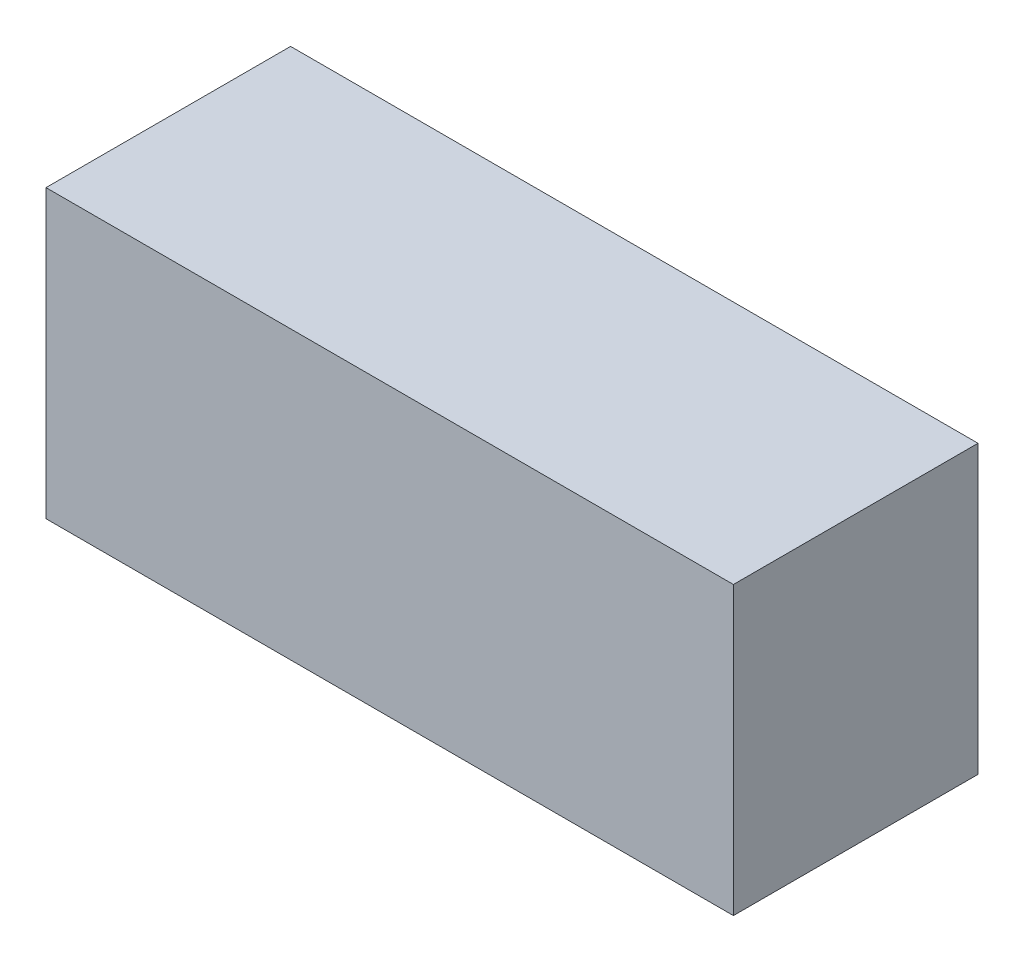
ISO-10303-21;
HEADER;
FILE_DESCRIPTION(('STEP AP214'),'2;1');
FILE_NAME('part.step','',(''),(''),'','','');
FILE_SCHEMA(('AUTOMOTIVE_DESIGN { 1 0 10303 214 1 1 1 1 }'));
ENDSEC;
DATA;
#1=APPLICATION_CONTEXT('core data for automotive mechanical design processes');
#2=APPLICATION_PROTOCOL_DEFINITION('international standard','automotive_design',2000,#1);
#3=PRODUCT_CONTEXT('',#1,'mechanical');
#4=PRODUCT('Part','Part','',(#3));
#5=PRODUCT_RELATED_PRODUCT_CATEGORY('part','',(#4));
#6=PRODUCT_DEFINITION_FORMATION('','',#4);
#7=PRODUCT_DEFINITION_CONTEXT('part definition',#1,'design');
#8=PRODUCT_DEFINITION('design','',#6,#7);
#9=PRODUCT_DEFINITION_SHAPE('','',#8);
#10=(LENGTH_UNIT() NAMED_UNIT(*) SI_UNIT(.MILLI.,.METRE.));
#11=(NAMED_UNIT(*) PLANE_ANGLE_UNIT() SI_UNIT($,.RADIAN.));
#12=(NAMED_UNIT(*) SI_UNIT($,.STERADIAN.) SOLID_ANGLE_UNIT());
#13=UNCERTAINTY_MEASURE_WITH_UNIT(LENGTH_MEASURE(1.E-05),#10,'distance_accuracy_value','');
#14=(GEOMETRIC_REPRESENTATION_CONTEXT(3) GLOBAL_UNCERTAINTY_ASSIGNED_CONTEXT((#13)) GLOBAL_UNIT_ASSIGNED_CONTEXT((#10,
#11,#12)) REPRESENTATION_CONTEXT('',''));
#15=CARTESIAN_POINT('',(0.,0.,0.));
#16=DIRECTION('',(0.,0.,1.));
#17=DIRECTION('',(1.,0.,0.));
#18=AXIS2_PLACEMENT_3D('',#15,#16,#17);
#19=CARTESIAN_POINT('',(32.6228000000035,-43.7918200006,1.19916001190173));
#20=DIRECTION('',(1.02069463991939E-11,1.,5.10341196927923E-12));
#21=DIRECTION('',(0.,5.10341196927923E-12,-1.));
#22=AXIS2_PLACEMENT_3D('',#19,#20,#21);
#23=PLANE('',#22);
#24=DIRECTION('',(0.,-5.10341196927923E-12,1.));
#25=VECTOR('',#24,1.);
#26=CARTESIAN_POINT('',(33.4378000000035,-43.7918200006068,0.909160011901735));
#27=LINE('',#26,#25);
#28=CARTESIAN_POINT('',(33.4378000000035,-43.7918200006068,0.909160011901735));
#29=VERTEX_POINT('',#28);
#30=CARTESIAN_POINT('',(33.4378000000035,-43.7918200006098,1.48916001190173));
#31=VERTEX_POINT('',#30);
#32=EDGE_CURVE('E97',#29,#31,#27,.T.);
#33=ORIENTED_EDGE('',*,*,#32,.F.);
#34=DIRECTION('',(1.,-1.02069463991939E-11,0.));
#35=VECTOR('',#34,1.);
#36=CARTESIAN_POINT('',(31.8078000000034,-43.7918200005902,0.909160011901735));
#37=LINE('',#36,#35);
#38=CARTESIAN_POINT('',(31.8078000000034,-43.7918200005902,0.909160011901735));
#39=VERTEX_POINT('',#38);
#40=EDGE_CURVE('E27',#39,#29,#37,.T.);
#41=ORIENTED_EDGE('',*,*,#40,.F.);
#42=DIRECTION('',(0.,5.10341196927923E-12,-1.));
#43=VECTOR('',#42,1.);
#44=CARTESIAN_POINT('',(31.8078000000034,-43.7918200005902,0.909160011901735));
#45=LINE('',#44,#43);
#46=CARTESIAN_POINT('',(31.8078000000034,-43.7918200005932,1.48916001190173));
#47=VERTEX_POINT('',#46);
#48=EDGE_CURVE('E64',#47,#39,#45,.T.);
#49=ORIENTED_EDGE('',*,*,#48,.F.);
#50=DIRECTION('',(-1.,1.02069463991939E-11,0.));
#51=VECTOR('',#50,1.);
#52=CARTESIAN_POINT('',(31.8078000000034,-43.7918200005932,1.48916001190173));
#53=LINE('',#52,#51);
#54=EDGE_CURVE('E86',#31,#47,#53,.T.);
#55=ORIENTED_EDGE('',*,*,#54,.F.);
#56=EDGE_LOOP('',(#33,#41,#49,#55));
#57=FACE_BOUND('',#56,.T.);
#58=ADVANCED_FACE('F16',(#57),#23,.T.);
#59=CARTESIAN_POINT('',(32.6227999999966,-44.4718200006,1.19916001189826));
#60=DIRECTION('',(1.02069463991939E-11,1.,5.10341196927923E-12));
#61=DIRECTION('',(0.,5.10341196927923E-12,-1.));
#62=AXIS2_PLACEMENT_3D('',#59,#60,#61);
#63=PLANE('',#62);
#64=DIRECTION('',(0.,-5.10341196927923E-12,1.));
#65=VECTOR('',#64,1.);
#66=CARTESIAN_POINT('',(33.4377999999966,-44.4718200006068,0.909160011898265));
#67=LINE('',#66,#65);
#68=CARTESIAN_POINT('',(33.4377999999966,-44.4718200006068,0.909160011898265));
#69=VERTEX_POINT('',#68);
#70=CARTESIAN_POINT('',(33.4377999999966,-44.4718200006098,1.48916001189826));
#71=VERTEX_POINT('',#70);
#72=EDGE_CURVE('E76',#69,#71,#67,.T.);
#73=ORIENTED_EDGE('',*,*,#72,.T.);
#74=DIRECTION('',(-1.,1.02069463991939E-11,0.));
#75=VECTOR('',#74,1.);
#76=CARTESIAN_POINT('',(31.8077999999966,-44.4718200005932,1.48916001189826));
#77=LINE('',#76,#75);
#78=CARTESIAN_POINT('',(31.8077999999966,-44.4718200005932,1.48916001189826));
#79=VERTEX_POINT('',#78);
#80=EDGE_CURVE('E110',#71,#79,#77,.T.);
#81=ORIENTED_EDGE('',*,*,#80,.T.);
#82=DIRECTION('',(0.,5.10341196927923E-12,-1.));
#83=VECTOR('',#82,1.);
#84=CARTESIAN_POINT('',(31.8077999999966,-44.4718200005902,0.909160011898265));
#85=LINE('',#84,#83);
#86=CARTESIAN_POINT('',(31.8077999999966,-44.4718200005902,0.909160011898265));
#87=VERTEX_POINT('',#86);
#88=EDGE_CURVE('E78',#79,#87,#85,.T.);
#89=ORIENTED_EDGE('',*,*,#88,.T.);
#90=DIRECTION('',(1.,-1.02069463991939E-11,0.));
#91=VECTOR('',#90,1.);
#92=CARTESIAN_POINT('',(31.8077999999966,-44.4718200005902,0.909160011898265));
#93=LINE('',#92,#91);
#94=EDGE_CURVE('E11',#87,#69,#93,.T.);
#95=ORIENTED_EDGE('',*,*,#94,.T.);
#96=EDGE_LOOP('',(#73,#81,#89,#95));
#97=FACE_BOUND('',#96,.T.);
#98=ADVANCED_FACE('F73',(#97),#63,.F.);
#99=CARTESIAN_POINT('',(31.8077999999966,-44.4718200005902,0.909160011898265));
#100=DIRECTION('',(0.,-5.10341196927923E-12,1.));
#101=DIRECTION('',(1.,-1.02069463991939E-11,0.));
#102=AXIS2_PLACEMENT_3D('',#99,#100,#101);
#103=PLANE('',#102);
#104=ORIENTED_EDGE('',*,*,#40,.T.);
#105=DIRECTION('',(1.02069463991939E-11,1.,5.10341196927923E-12));
#106=VECTOR('',#105,1.);
#107=CARTESIAN_POINT('',(33.4377999999966,-44.4718200006068,0.909160011898265));
#108=LINE('',#107,#106);
#109=EDGE_CURVE('E81',#69,#29,#108,.T.);
#110=ORIENTED_EDGE('',*,*,#109,.F.);
#111=ORIENTED_EDGE('',*,*,#94,.F.);
#112=DIRECTION('',(1.02069463991939E-11,1.,5.10341196927923E-12));
#113=VECTOR('',#112,1.);
#114=CARTESIAN_POINT('',(31.8077999999966,-44.4718200005902,0.909160011898265));
#115=LINE('',#114,#113);
#116=EDGE_CURVE('E20',#87,#39,#115,.T.);
#117=ORIENTED_EDGE('',*,*,#116,.T.);
#118=EDGE_LOOP('',(#104,#110,#111,#117));
#119=FACE_BOUND('',#118,.T.);
#120=ADVANCED_FACE('F18',(#119),#103,.F.);
#121=CARTESIAN_POINT('',(31.8077999999966,-44.4718200005902,0.909160011898265));
#122=DIRECTION('',(1.,-1.02069463991939E-11,0.));
#123=DIRECTION('',(0.,-5.10341196927923E-12,1.));
#124=AXIS2_PLACEMENT_3D('',#121,#122,#123);
#125=PLANE('',#124);
#126=ORIENTED_EDGE('',*,*,#48,.T.);
#127=ORIENTED_EDGE('',*,*,#116,.F.);
#128=ORIENTED_EDGE('',*,*,#88,.F.);
#129=DIRECTION('',(1.02069463991939E-11,1.,5.10341196927923E-12));
#130=VECTOR('',#129,1.);
#131=CARTESIAN_POINT('',(31.8077999999966,-44.4718200005932,1.48916001189826));
#132=LINE('',#131,#130);
#133=EDGE_CURVE('E104',#79,#47,#132,.T.);
#134=ORIENTED_EDGE('',*,*,#133,.T.);
#135=EDGE_LOOP('',(#126,#127,#128,#134));
#136=FACE_BOUND('',#135,.T.);
#137=ADVANCED_FACE('F125',(#136),#125,.F.);
#138=CARTESIAN_POINT('',(31.8077999999966,-44.4718200005932,1.48916001189826));
#139=DIRECTION('',(0.,5.10341196927923E-12,-1.));
#140=DIRECTION('',(1.02069463991939E-11,1.,5.10341196927923E-12));
#141=AXIS2_PLACEMENT_3D('',#138,#139,#140);
#142=PLANE('',#141);
#143=ORIENTED_EDGE('',*,*,#54,.T.);
#144=ORIENTED_EDGE('',*,*,#133,.F.);
#145=ORIENTED_EDGE('',*,*,#80,.F.);
#146=DIRECTION('',(1.02069463991939E-11,1.,5.10341196927923E-12));
#147=VECTOR('',#146,1.);
#148=CARTESIAN_POINT('',(33.4377999999966,-44.4718200006098,1.48916001189826));
#149=LINE('',#148,#147);
#150=EDGE_CURVE('E90',#71,#31,#149,.T.);
#151=ORIENTED_EDGE('',*,*,#150,.T.);
#152=EDGE_LOOP('',(#143,#144,#145,#151));
#153=FACE_BOUND('',#152,.T.);
#154=ADVANCED_FACE('F123',(#153),#142,.F.);
#155=CARTESIAN_POINT('',(33.4377999999966,-44.4718200006068,0.909160011898265));
#156=DIRECTION('',(-1.,1.02069463991939E-11,0.));
#157=DIRECTION('',(-1.02069463991939E-11,-1.,-5.10341196927923E-12));
#158=AXIS2_PLACEMENT_3D('',#155,#156,#157);
#159=PLANE('',#158);
#160=ORIENTED_EDGE('',*,*,#32,.T.);
#161=ORIENTED_EDGE('',*,*,#150,.F.);
#162=ORIENTED_EDGE('',*,*,#72,.F.);
#163=ORIENTED_EDGE('',*,*,#109,.T.);
#164=EDGE_LOOP('',(#160,#161,#162,#163));
#165=FACE_BOUND('',#164,.T.);
#166=ADVANCED_FACE('F88',(#165),#159,.F.);
#167=CLOSED_SHELL('',(#58,#98,#120,#137,#154,#166));
#168=MANIFOLD_SOLID_BREP('B1',#167);
#169=ADVANCED_BREP_SHAPE_REPRESENTATION('',(#18,#168),#14);
#170=SHAPE_DEFINITION_REPRESENTATION(#9,#169);
ENDSEC;
END-ISO-10303-21;
